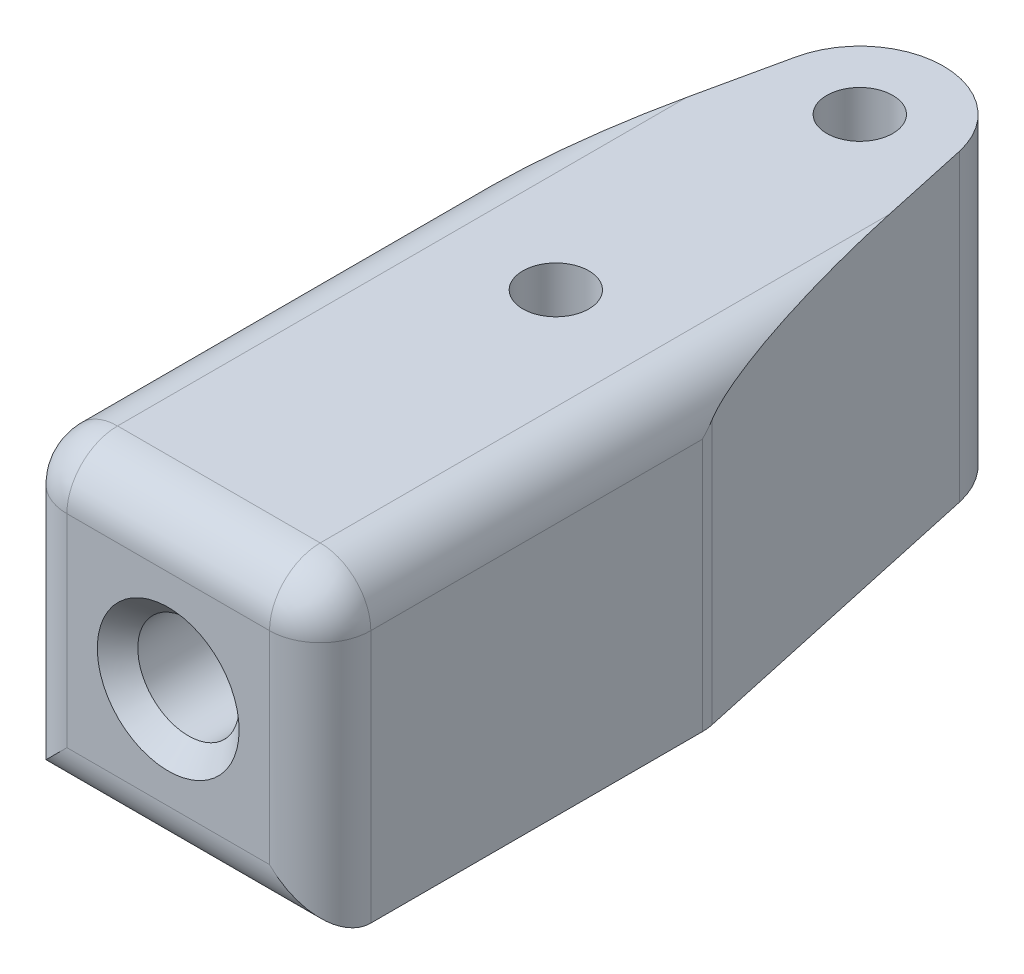
ISO-10303-21;
HEADER;
FILE_DESCRIPTION(('STEP AP214'),'2;1');
FILE_NAME('part.step','',(''),(''),'','','');
FILE_SCHEMA(('AUTOMOTIVE_DESIGN { 1 0 10303 214 1 1 1 1 }'));
ENDSEC;
DATA;
#1=APPLICATION_CONTEXT('core data for automotive mechanical design processes');
#2=APPLICATION_PROTOCOL_DEFINITION('international standard','automotive_design',2000,#1);
#3=PRODUCT_CONTEXT('',#1,'mechanical');
#4=PRODUCT('Part','Part','',(#3));
#5=PRODUCT_RELATED_PRODUCT_CATEGORY('part','',(#4));
#6=PRODUCT_DEFINITION_FORMATION('','',#4);
#7=PRODUCT_DEFINITION_CONTEXT('part definition',#1,'design');
#8=PRODUCT_DEFINITION('design','',#6,#7);
#9=PRODUCT_DEFINITION_SHAPE('','',#8);
#10=(LENGTH_UNIT() NAMED_UNIT(*) SI_UNIT(.MILLI.,.METRE.));
#11=(NAMED_UNIT(*) PLANE_ANGLE_UNIT() SI_UNIT($,.RADIAN.));
#12=(NAMED_UNIT(*) SI_UNIT($,.STERADIAN.) SOLID_ANGLE_UNIT());
#13=UNCERTAINTY_MEASURE_WITH_UNIT(LENGTH_MEASURE(1.E-05),#10,'distance_accuracy_value','');
#14=(GEOMETRIC_REPRESENTATION_CONTEXT(3) GLOBAL_UNCERTAINTY_ASSIGNED_CONTEXT((#13)) GLOBAL_UNIT_ASSIGNED_CONTEXT((#10,
#11,#12)) REPRESENTATION_CONTEXT('',''));
#15=CARTESIAN_POINT('',(0.,0.,0.));
#16=DIRECTION('',(0.,0.,1.));
#17=DIRECTION('',(1.,0.,0.));
#18=AXIS2_PLACEMENT_3D('',#15,#16,#17);
#19=CARTESIAN_POINT('',(9.09215471737954,19.05,-1.98380852863201));
#20=DIRECTION('',(-0.977014291455933,0.,0.213173812394633));
#21=DIRECTION('',(0.213173812394633,0.,0.977014291455933));
#22=AXIS2_PLACEMENT_3D('',#19,#20,#21);
#23=PLANE('',#22);
#24=CARTESIAN_POINT('',(6.34999999999999,15.875,-14.5516015336352));
#25=DIRECTION('',(-0.977014291455933,0.,0.213173812394633));
#26=DIRECTION('',(0.213173812394633,0.,0.977014291455933));
#27=AXIS2_PLACEMENT_3D('',#24,#25,#26);
#28=ELLIPSE('',#27,14.8939495162866,3.175);
#29=CARTESIAN_POINT('',(6.34999999999999,19.05,-14.5516015336352));
#30=VERTEX_POINT('',#29);
#31=CARTESIAN_POINT('',(9.45202037537258,16.551826854353,-0.334478871701571));
#32=VERTEX_POINT('',#31);
#33=EDGE_CURVE('E44',#30,#32,#28,.F.);
#34=ORIENTED_EDGE('',*,*,#33,.T.);
#35=DIRECTION('',(0.,-1.,0.));
#36=VECTOR('',#35,1.);
#37=CARTESIAN_POINT('',(9.45202037537258,19.05,-0.334478871701571));
#38=LINE('',#37,#36);
#39=CARTESIAN_POINT('',(9.45202037537258,0.,-0.334478871701571));
#40=VERTEX_POINT('',#39);
#41=EDGE_CURVE('E11',#32,#40,#38,.T.);
#42=ORIENTED_EDGE('',*,*,#41,.T.);
#43=DIRECTION('',(-0.213173812394633,0.,-0.977014291455933));
#44=VECTOR('',#43,1.);
#45=CARTESIAN_POINT('',(9.09215471737954,0.,-1.98380852863201));
#46=LINE('',#45,#44);
#47=CARTESIAN_POINT('',(5.12453766011551,0.,-20.1681179633911));
#48=VERTEX_POINT('',#47);
#49=EDGE_CURVE('E146',#40,#48,#46,.T.);
#50=ORIENTED_EDGE('',*,*,#49,.T.);
#51=DIRECTION('',(0.,-1.,0.));
#52=VECTOR('',#51,1.);
#53=CARTESIAN_POINT('',(5.12453766011551,19.05,-20.1681179633911));
#54=LINE('',#53,#52);
#55=CARTESIAN_POINT('',(5.12453766011551,19.05,-20.1681179633911));
#56=VERTEX_POINT('',#55);
#57=EDGE_CURVE('E140',#56,#48,#54,.T.);
#58=ORIENTED_EDGE('',*,*,#57,.F.);
#59=DIRECTION('',(-0.213173812394633,0.,-0.977014291455933));
#60=VECTOR('',#59,1.);
#61=CARTESIAN_POINT('',(9.09215471737954,19.05,-1.98380852863201));
#62=LINE('',#61,#60);
#63=EDGE_CURVE('E125',#30,#56,#62,.T.);
#64=ORIENTED_EDGE('',*,*,#63,.F.);
#65=EDGE_LOOP('',(#34,#42,#50,#58,#64));
#66=FACE_BOUND('',#65,.T.);
#67=ADVANCED_FACE('F35',(#66),#23,.F.);
#68=CARTESIAN_POINT('',(0.,19.05,-19.05));
#69=DIRECTION('',(0.,-1.,0.));
#70=DIRECTION('',(0.,0.,-1.));
#71=AXIS2_PLACEMENT_3D('',#68,#69,#70);
#72=CYLINDRICAL_SURFACE('',#71,5.2451);
#73=CARTESIAN_POINT('',(0.,0.,-19.05));
#74=DIRECTION('',(0.,1.,0.));
#75=DIRECTION('',(0.,0.,1.));
#76=AXIS2_PLACEMENT_3D('',#73,#74,#75);
#77=CIRCLE('',#76,5.2451);
#78=CARTESIAN_POINT('',(-5.12453766011551,0.,-20.1681179633911));
#79=VERTEX_POINT('',#78);
#80=EDGE_CURVE('E245',#48,#79,#77,.T.);
#81=ORIENTED_EDGE('',*,*,#80,.T.);
#82=DIRECTION('',(0.,-1.,0.));
#83=VECTOR('',#82,1.);
#84=CARTESIAN_POINT('',(-5.12453766011551,19.05,-20.1681179633911));
#85=LINE('',#84,#83);
#86=CARTESIAN_POINT('',(-5.12453766011551,19.05,-20.1681179633911));
#87=VERTEX_POINT('',#86);
#88=EDGE_CURVE('E142',#87,#79,#85,.T.);
#89=ORIENTED_EDGE('',*,*,#88,.F.);
#90=CARTESIAN_POINT('',(0.,19.05,-19.05));
#91=DIRECTION('',(0.,1.,0.));
#92=DIRECTION('',(0.,0.,1.));
#93=AXIS2_PLACEMENT_3D('',#90,#91,#92);
#94=CIRCLE('',#93,5.2451);
#95=EDGE_CURVE('E129',#56,#87,#94,.T.);
#96=ORIENTED_EDGE('',*,*,#95,.F.);
#97=ORIENTED_EDGE('',*,*,#57,.T.);
#98=EDGE_LOOP('',(#81,#89,#96,#97));
#99=FACE_BOUND('',#98,.T.);
#100=ADVANCED_FACE('F139',(#99),#72,.T.);
#101=CARTESIAN_POINT('',(-9.09215471737955,19.05,-1.98380852863202));
#102=DIRECTION('',(-0.977014291455933,0.,-0.213173812394633));
#103=DIRECTION('',(-0.213173812394633,0.,0.977014291455933));
#104=AXIS2_PLACEMENT_3D('',#101,#102,#103);
#105=PLANE('',#104);
#106=DIRECTION('',(0.213173812394633,0.,-0.977014291455933));
#107=VECTOR('',#106,1.);
#108=CARTESIAN_POINT('',(-9.09215471737955,0.,-1.98380852863202));
#109=LINE('',#108,#107);
#110=CARTESIAN_POINT('',(-9.45202037537259,0.,-0.334478871701568));
#111=VERTEX_POINT('',#110);
#112=EDGE_CURVE('E247',#111,#79,#109,.T.);
#113=ORIENTED_EDGE('',*,*,#112,.F.);
#114=DIRECTION('',(0.,-1.,0.));
#115=VECTOR('',#114,1.);
#116=CARTESIAN_POINT('',(-9.45202037537259,19.05,-0.334478871701569));
#117=LINE('',#116,#115);
#118=CARTESIAN_POINT('',(-9.45202037537259,16.551826854353,-0.334478871701569));
#119=VERTEX_POINT('',#118);
#120=EDGE_CURVE('E58',#111,#119,#117,.F.);
#121=ORIENTED_EDGE('',*,*,#120,.T.);
#122=CARTESIAN_POINT('',(-6.35000000000001,15.875,-14.5516015336351));
#123=DIRECTION('',(-0.977014291455933,0.,-0.213173812394633));
#124=DIRECTION('',(0.213173812394633,0.,-0.977014291455933));
#125=AXIS2_PLACEMENT_3D('',#122,#123,#124);
#126=ELLIPSE('',#125,14.8939495162865,3.175);
#127=CARTESIAN_POINT('',(-6.35,19.05,-14.5516015336351));
#128=VERTEX_POINT('',#127);
#129=EDGE_CURVE('E191',#119,#128,#126,.T.);
#130=ORIENTED_EDGE('',*,*,#129,.T.);
#131=DIRECTION('',(0.213173812394633,0.,-0.977014291455933));
#132=VECTOR('',#131,1.);
#133=CARTESIAN_POINT('',(-9.09215471737955,19.05,-1.98380852863202));
#134=LINE('',#133,#132);
#135=EDGE_CURVE('E143',#128,#87,#134,.T.);
#136=ORIENTED_EDGE('',*,*,#135,.T.);
#137=ORIENTED_EDGE('',*,*,#88,.T.);
#138=EDGE_LOOP('',(#113,#121,#130,#136,#137));
#139=FACE_BOUND('',#138,.T.);
#140=ADVANCED_FACE('F284',(#139),#105,.T.);
#141=CARTESIAN_POINT('',(-9.525,19.05,0.));
#142=DIRECTION('',(-1.,0.,0.));
#143=DIRECTION('',(0.,0.,1.));
#144=AXIS2_PLACEMENT_3D('',#141,#142,#143);
#145=PLANE('',#144);
#146=DIRECTION('',(0.,0.,-1.));
#147=VECTOR('',#146,1.);
#148=CARTESIAN_POINT('',(-9.525,0.,0.));
#149=LINE('',#148,#147);
#150=CARTESIAN_POINT('',(-9.525,0.,21.1201));
#151=VERTEX_POINT('',#150);
#152=CARTESIAN_POINT('',(-9.525,0.,0.342347982651392));
#153=VERTEX_POINT('',#152);
#154=EDGE_CURVE('E249',#151,#153,#149,.T.);
#155=ORIENTED_EDGE('',*,*,#154,.F.);
#156=DIRECTION('',(0.,-1.,0.));
#157=VECTOR('',#156,1.);
#158=CARTESIAN_POINT('',(-9.525,19.05,21.1201));
#159=LINE('',#158,#157);
#160=CARTESIAN_POINT('',(-9.525,15.875,21.1201));
#161=VERTEX_POINT('',#160);
#162=EDGE_CURVE('E189',#151,#161,#159,.F.);
#163=ORIENTED_EDGE('',*,*,#162,.T.);
#164=DIRECTION('',(0.,0.,-1.));
#165=VECTOR('',#164,1.);
#166=CARTESIAN_POINT('',(-9.525,15.875,0.));
#167=LINE('',#166,#165);
#168=CARTESIAN_POINT('',(-9.525,15.875,0.342347982651392));
#169=VERTEX_POINT('',#168);
#170=EDGE_CURVE('E185',#161,#169,#167,.T.);
#171=ORIENTED_EDGE('',*,*,#170,.T.);
#172=DIRECTION('',(0.,-1.,0.));
#173=VECTOR('',#172,1.);
#174=CARTESIAN_POINT('',(-9.525,19.05,0.342347982651392));
#175=LINE('',#174,#173);
#176=EDGE_CURVE('E187',#169,#153,#175,.T.);
#177=ORIENTED_EDGE('',*,*,#176,.T.);
#178=EDGE_LOOP('',(#155,#163,#171,#177));
#179=FACE_BOUND('',#178,.T.);
#180=ADVANCED_FACE('F280',(#179),#145,.T.);
#181=CARTESIAN_POINT('',(0.,19.05,24.2951));
#182=DIRECTION('',(0.,0.,1.));
#183=DIRECTION('',(1.,0.,0.));
#184=AXIS2_PLACEMENT_3D('',#181,#182,#183);
#185=PLANE('',#184);
#186=DIRECTION('',(-1.,0.,0.));
#187=VECTOR('',#186,1.);
#188=CARTESIAN_POINT('',(9.525,3.175,24.2951));
#189=LINE('',#188,#187);
#190=CARTESIAN_POINT('',(-6.35,3.175,24.2951));
#191=VERTEX_POINT('',#190);
#192=CARTESIAN_POINT('',(6.35,3.175,24.2951));
#193=VERTEX_POINT('',#192);
#194=EDGE_CURVE('E169',#191,#193,#189,.F.);
#195=ORIENTED_EDGE('',*,*,#194,.T.);
#196=DIRECTION('',(0.,-1.,0.));
#197=VECTOR('',#196,1.);
#198=CARTESIAN_POINT('',(6.35,19.05,24.2951));
#199=LINE('',#198,#197);
#200=CARTESIAN_POINT('',(6.35,15.875,24.2951));
#201=VERTEX_POINT('',#200);
#202=EDGE_CURVE('E172',#193,#201,#199,.F.);
#203=ORIENTED_EDGE('',*,*,#202,.T.);
#204=DIRECTION('',(-1.,0.,0.));
#205=VECTOR('',#204,1.);
#206=CARTESIAN_POINT('',(0.,15.875,24.2951));
#207=LINE('',#206,#205);
#208=CARTESIAN_POINT('',(-6.35,15.875,24.2951));
#209=VERTEX_POINT('',#208);
#210=EDGE_CURVE('E167',#201,#209,#207,.T.);
#211=ORIENTED_EDGE('',*,*,#210,.T.);
#212=DIRECTION('',(0.,-1.,0.));
#213=VECTOR('',#212,1.);
#214=CARTESIAN_POINT('',(-6.35,19.05,24.2951));
#215=LINE('',#214,#213);
#216=EDGE_CURVE('E165',#209,#191,#215,.T.);
#217=ORIENTED_EDGE('',*,*,#216,.T.);
#218=EDGE_LOOP('',(#195,#203,#211,#217));
#219=FACE_BOUND('',#218,.T.);
#220=CARTESIAN_POINT('',(0.,9.52499999999823,24.2951));
#221=DIRECTION('',(0.,0.,1.));
#222=DIRECTION('',(1.,0.,0.));
#223=AXIS2_PLACEMENT_3D('',#220,#221,#222);
#224=CIRCLE('',#223,4.44500000000004);
#225=CARTESIAN_POINT('',(4.44500000000004,9.52499999999823,24.2951));
#226=VERTEX_POINT('',#225);
#227=EDGE_CURVE('E151',#226,#226,#224,.F.);
#228=ORIENTED_EDGE('',*,*,#227,.T.);
#229=EDGE_LOOP('',(#228));
#230=FACE_BOUND('',#229,.T.);
#231=ADVANCED_FACE('F298',(#219,#230),#185,.T.);
#232=CARTESIAN_POINT('',(0.,19.05,-19.05));
#233=DIRECTION('',(0.,-1.,0.));
#234=DIRECTION('',(0.,0.,-1.));
#235=AXIS2_PLACEMENT_3D('',#232,#233,#234);
#236=CYLINDRICAL_SURFACE('',#235,2.0701);
#237=CARTESIAN_POINT('',(0.,19.05,-19.05));
#238=DIRECTION('',(0.,1.,0.));
#239=DIRECTION('',(0.,0.,1.));
#240=AXIS2_PLACEMENT_3D('',#237,#238,#239);
#241=CIRCLE('',#240,2.0701);
#242=CARTESIAN_POINT('',(0.,19.05,-21.1201));
#243=VERTEX_POINT('',#242);
#244=EDGE_CURVE('E134',#243,#243,#241,.T.);
#245=CARTESIAN_POINT('',(0.,0.,-19.05));
#246=DIRECTION('',(0.,1.,0.));
#247=DIRECTION('',(0.,0.,1.));
#248=AXIS2_PLACEMENT_3D('',#245,#246,#247);
#249=CIRCLE('',#248,2.0701);
#250=CARTESIAN_POINT('',(0.,0.,-21.1201));
#251=VERTEX_POINT('',#250);
#252=EDGE_CURVE('E232',#251,#251,#249,.T.);
#253=CARTESIAN_POINT('',(0.,19.05,-21.1201));
#254=CARTESIAN_POINT('',(0.,18.8515625,-21.1201));
#255=CARTESIAN_POINT('',(0.,18.653125,-21.1201));
#256=CARTESIAN_POINT('',(0.,18.25625,-21.1201));
#257=CARTESIAN_POINT('',(0.,18.0578125,-21.1201));
#258=CARTESIAN_POINT('',(0.,17.6609375,-21.1201));
#259=CARTESIAN_POINT('',(0.,17.4625,-21.1201));
#260=CARTESIAN_POINT('',(0.,17.065625,-21.1201));
#261=CARTESIAN_POINT('',(0.,16.8671875,-21.1201));
#262=CARTESIAN_POINT('',(0.,16.4703125,-21.1201));
#263=CARTESIAN_POINT('',(0.,16.271875,-21.1201));
#264=CARTESIAN_POINT('',(0.,15.875,-21.1201));
#265=CARTESIAN_POINT('',(0.,15.6765625,-21.1201));
#266=CARTESIAN_POINT('',(0.,15.2796875,-21.1201));
#267=CARTESIAN_POINT('',(0.,15.08125,-21.1201));
#268=CARTESIAN_POINT('',(0.,14.684375,-21.1201));
#269=CARTESIAN_POINT('',(0.,14.4859375,-21.1201));
#270=CARTESIAN_POINT('',(0.,14.0890625,-21.1201));
#271=CARTESIAN_POINT('',(0.,13.890625,-21.1201));
#272=CARTESIAN_POINT('',(0.,13.49375,-21.1201));
#273=CARTESIAN_POINT('',(0.,13.2953125,-21.1201));
#274=CARTESIAN_POINT('',(0.,12.8984375,-21.1201));
#275=CARTESIAN_POINT('',(0.,12.7,-21.1201));
#276=CARTESIAN_POINT('',(0.,12.303125,-21.1201));
#277=CARTESIAN_POINT('',(0.,12.1046875,-21.1201));
#278=CARTESIAN_POINT('',(0.,11.7078125,-21.1201));
#279=CARTESIAN_POINT('',(0.,11.509375,-21.1201));
#280=CARTESIAN_POINT('',(0.,11.1125,-21.1201));
#281=CARTESIAN_POINT('',(0.,10.9140625,-21.1201));
#282=CARTESIAN_POINT('',(0.,10.5171875,-21.1201));
#283=CARTESIAN_POINT('',(0.,10.31875,-21.1201));
#284=CARTESIAN_POINT('',(0.,9.921875,-21.1201));
#285=CARTESIAN_POINT('',(0.,9.7234375,-21.1201));
#286=CARTESIAN_POINT('',(0.,9.3265625,-21.1201));
#287=CARTESIAN_POINT('',(0.,9.128125,-21.1201));
#288=CARTESIAN_POINT('',(0.,8.73125,-21.1201));
#289=CARTESIAN_POINT('',(0.,8.5328125,-21.1201));
#290=CARTESIAN_POINT('',(0.,8.1359375,-21.1201));
#291=CARTESIAN_POINT('',(0.,7.9375,-21.1201));
#292=CARTESIAN_POINT('',(0.,7.540625,-21.1201));
#293=CARTESIAN_POINT('',(0.,7.3421875,-21.1201));
#294=CARTESIAN_POINT('',(0.,6.9453125,-21.1201));
#295=CARTESIAN_POINT('',(0.,6.746875,-21.1201));
#296=CARTESIAN_POINT('',(0.,6.35,-21.1201));
#297=CARTESIAN_POINT('',(0.,6.1515625,-21.1201));
#298=CARTESIAN_POINT('',(0.,5.7546875,-21.1201));
#299=CARTESIAN_POINT('',(0.,5.55625,-21.1201));
#300=CARTESIAN_POINT('',(0.,5.159375,-21.1201));
#301=CARTESIAN_POINT('',(0.,4.9609375,-21.1201));
#302=CARTESIAN_POINT('',(0.,4.5640625,-21.1201));
#303=CARTESIAN_POINT('',(0.,4.365625,-21.1201));
#304=CARTESIAN_POINT('',(0.,3.96875,-21.1201));
#305=CARTESIAN_POINT('',(0.,3.7703125,-21.1201));
#306=CARTESIAN_POINT('',(0.,3.3734375,-21.1201));
#307=CARTESIAN_POINT('',(0.,3.175,-21.1201));
#308=CARTESIAN_POINT('',(0.,2.778125,-21.1201));
#309=CARTESIAN_POINT('',(0.,2.5796875,-21.1201));
#310=CARTESIAN_POINT('',(0.,2.1828125,-21.1201));
#311=CARTESIAN_POINT('',(0.,1.984375,-21.1201));
#312=CARTESIAN_POINT('',(0.,1.5875,-21.1201));
#313=CARTESIAN_POINT('',(0.,1.3890625,-21.1201));
#314=CARTESIAN_POINT('',(0.,0.992187500000001,-21.1201));
#315=CARTESIAN_POINT('',(0.,0.793750000000001,-21.1201));
#316=CARTESIAN_POINT('',(0.,0.396875,-21.1201));
#317=CARTESIAN_POINT('',(0.,0.1984375,-21.1201));
#318=CARTESIAN_POINT('',(0.,0.,-21.1201));
#319=B_SPLINE_CURVE_WITH_KNOTS('',3,(#253,#254,#255,#256,#257,#258,#259,#260,#261,#262,#263,
#264,#265,#266,#267,#268,#269,#270,#271,#272,#273,#274,#275,#276,#277,#278,#279,#280,#281,#282,
#283,#284,#285,#286,#287,#288,#289,#290,#291,#292,#293,#294,#295,#296,#297,#298,#299,#300,#301,
#302,#303,#304,#305,#306,#307,#308,#309,#310,#311,#312,#313,#314,#315,#316,#317,#318),
.UNSPECIFIED.,.F.,.F.,(4,2,2,2,2,2,2,2,2,2,2,2,2,2,2,2,2,2,2,2,2,2,2,2,2,2,2,2,2,2,2,2,4),(0.,
0.5953125,1.190625,1.7859375,2.38125,2.9765625,3.571875,4.1671875,4.7625,5.3578125,5.953125,
6.5484375,7.14375,7.7390625,8.334375,8.9296875,9.525,10.1203125,10.715625,11.3109375,11.90625,
12.5015625,13.096875,13.6921875,14.2875,14.8828125,15.478125,16.0734375,16.66875,17.2640625,
17.859375,18.4546875,19.05),.UNSPECIFIED.);
#320=EDGE_CURVE('BSEAM318',#243,#251,#319,.T.);
#321=ORIENTED_EDGE('',*,*,#244,.T.);
#322=ORIENTED_EDGE('',*,*,#252,.F.);
#323=ORIENTED_EDGE('',*,*,#320,.T.);
#324=ORIENTED_EDGE('',*,*,#320,.F.);
#325=EDGE_LOOP('',(#321,#323,#322,#324));
#326=FACE_BOUND('',#325,.T.);
#327=ADVANCED_FACE('F318',(#326),#236,.F.);
#328=CARTESIAN_POINT('',(0.,19.05,0.));
#329=DIRECTION('',(0.,-1.,0.));
#330=DIRECTION('',(0.,0.,-1.));
#331=AXIS2_PLACEMENT_3D('',#328,#329,#330);
#332=CYLINDRICAL_SURFACE('',#331,2.0701);
#333=CARTESIAN_POINT('',(0.,19.05,0.));
#334=DIRECTION('',(0.,1.,0.));
#335=DIRECTION('',(0.,0.,1.));
#336=AXIS2_PLACEMENT_3D('',#333,#334,#335);
#337=CIRCLE('',#336,2.0701);
#338=CARTESIAN_POINT('',(0.,19.05,-2.07010000000002));
#339=VERTEX_POINT('',#338);
#340=EDGE_CURVE('E235',#339,#339,#337,.T.);
#341=CARTESIAN_POINT('',(0.,0.,0.));
#342=DIRECTION('',(0.,1.,0.));
#343=DIRECTION('',(0.,0.,1.));
#344=AXIS2_PLACEMENT_3D('',#341,#342,#343);
#345=CIRCLE('',#344,2.0701);
#346=CARTESIAN_POINT('',(0.,0.,-2.07010000000002));
#347=VERTEX_POINT('',#346);
#348=EDGE_CURVE('E227',#347,#347,#345,.T.);
#349=CARTESIAN_POINT('',(0.,19.05,-2.07010000000002));
#350=CARTESIAN_POINT('',(0.,18.8515625,-2.07010000000002));
#351=CARTESIAN_POINT('',(0.,18.653125,-2.07010000000002));
#352=CARTESIAN_POINT('',(0.,18.25625,-2.07010000000002));
#353=CARTESIAN_POINT('',(0.,18.0578125,-2.07010000000002));
#354=CARTESIAN_POINT('',(0.,17.6609375,-2.07010000000002));
#355=CARTESIAN_POINT('',(0.,17.4625,-2.07010000000002));
#356=CARTESIAN_POINT('',(0.,17.065625,-2.07010000000002));
#357=CARTESIAN_POINT('',(0.,16.8671875,-2.07010000000002));
#358=CARTESIAN_POINT('',(0.,16.4703125,-2.07010000000002));
#359=CARTESIAN_POINT('',(0.,16.271875,-2.07010000000002));
#360=CARTESIAN_POINT('',(0.,15.875,-2.07010000000002));
#361=CARTESIAN_POINT('',(0.,15.6765625,-2.07010000000002));
#362=CARTESIAN_POINT('',(0.,15.2796875,-2.07010000000002));
#363=CARTESIAN_POINT('',(0.,15.08125,-2.07010000000002));
#364=CARTESIAN_POINT('',(0.,14.684375,-2.07010000000002));
#365=CARTESIAN_POINT('',(0.,14.4859375,-2.07010000000002));
#366=CARTESIAN_POINT('',(0.,14.0890625,-2.07010000000002));
#367=CARTESIAN_POINT('',(0.,13.890625,-2.07010000000002));
#368=CARTESIAN_POINT('',(0.,13.49375,-2.07010000000002));
#369=CARTESIAN_POINT('',(0.,13.2953125,-2.07010000000002));
#370=CARTESIAN_POINT('',(0.,12.8984375,-2.07010000000002));
#371=CARTESIAN_POINT('',(0.,12.7,-2.07010000000002));
#372=CARTESIAN_POINT('',(0.,12.303125,-2.07010000000002));
#373=CARTESIAN_POINT('',(0.,12.1046875,-2.07010000000002));
#374=CARTESIAN_POINT('',(0.,11.7078125,-2.07010000000002));
#375=CARTESIAN_POINT('',(0.,11.509375,-2.07010000000002));
#376=CARTESIAN_POINT('',(0.,11.1125,-2.07010000000002));
#377=CARTESIAN_POINT('',(0.,10.9140625,-2.07010000000002));
#378=CARTESIAN_POINT('',(0.,10.5171875,-2.07010000000002));
#379=CARTESIAN_POINT('',(0.,10.31875,-2.07010000000002));
#380=CARTESIAN_POINT('',(0.,9.921875,-2.07010000000002));
#381=CARTESIAN_POINT('',(0.,9.7234375,-2.07010000000002));
#382=CARTESIAN_POINT('',(0.,9.3265625,-2.07010000000002));
#383=CARTESIAN_POINT('',(0.,9.128125,-2.07010000000002));
#384=CARTESIAN_POINT('',(0.,8.73125,-2.07010000000002));
#385=CARTESIAN_POINT('',(0.,8.5328125,-2.07010000000002));
#386=CARTESIAN_POINT('',(0.,8.1359375,-2.07010000000002));
#387=CARTESIAN_POINT('',(0.,7.9375,-2.07010000000002));
#388=CARTESIAN_POINT('',(0.,7.540625,-2.07010000000002));
#389=CARTESIAN_POINT('',(0.,7.3421875,-2.07010000000002));
#390=CARTESIAN_POINT('',(0.,6.9453125,-2.07010000000002));
#391=CARTESIAN_POINT('',(0.,6.746875,-2.07010000000002));
#392=CARTESIAN_POINT('',(0.,6.35,-2.07010000000002));
#393=CARTESIAN_POINT('',(0.,6.1515625,-2.07010000000002));
#394=CARTESIAN_POINT('',(0.,5.7546875,-2.07010000000002));
#395=CARTESIAN_POINT('',(0.,5.55625,-2.07010000000002));
#396=CARTESIAN_POINT('',(0.,5.159375,-2.07010000000002));
#397=CARTESIAN_POINT('',(0.,4.9609375,-2.07010000000002));
#398=CARTESIAN_POINT('',(0.,4.5640625,-2.07010000000002));
#399=CARTESIAN_POINT('',(0.,4.365625,-2.07010000000002));
#400=CARTESIAN_POINT('',(0.,3.96875,-2.07010000000002));
#401=CARTESIAN_POINT('',(0.,3.7703125,-2.07010000000002));
#402=CARTESIAN_POINT('',(0.,3.3734375,-2.07010000000002));
#403=CARTESIAN_POINT('',(0.,3.175,-2.07010000000002));
#404=CARTESIAN_POINT('',(0.,2.778125,-2.07010000000002));
#405=CARTESIAN_POINT('',(0.,2.5796875,-2.07010000000002));
#406=CARTESIAN_POINT('',(0.,2.1828125,-2.07010000000002));
#407=CARTESIAN_POINT('',(0.,1.984375,-2.07010000000002));
#408=CARTESIAN_POINT('',(0.,1.5875,-2.07010000000002));
#409=CARTESIAN_POINT('',(0.,1.3890625,-2.07010000000002));
#410=CARTESIAN_POINT('',(0.,0.992187500000001,-2.07010000000002));
#411=CARTESIAN_POINT('',(0.,0.793750000000001,-2.07010000000002));
#412=CARTESIAN_POINT('',(0.,0.396875,-2.07010000000002));
#413=CARTESIAN_POINT('',(0.,0.1984375,-2.07010000000002));
#414=CARTESIAN_POINT('',(0.,0.,-2.07010000000002));
#415=B_SPLINE_CURVE_WITH_KNOTS('',3,(#349,#350,#351,#352,#353,#354,#355,#356,#357,#358,#359,
#360,#361,#362,#363,#364,#365,#366,#367,#368,#369,#370,#371,#372,#373,#374,#375,#376,#377,#378,
#379,#380,#381,#382,#383,#384,#385,#386,#387,#388,#389,#390,#391,#392,#393,#394,#395,#396,#397,
#398,#399,#400,#401,#402,#403,#404,#405,#406,#407,#408,#409,#410,#411,#412,#413,#414),
.UNSPECIFIED.,.F.,.F.,(4,2,2,2,2,2,2,2,2,2,2,2,2,2,2,2,2,2,2,2,2,2,2,2,2,2,2,2,2,2,2,2,4),(0.,
0.5953125,1.190625,1.7859375,2.38125,2.9765625,3.571875,4.1671875,4.7625,5.3578125,5.953125,
6.5484375,7.14375,7.7390625,8.334375,8.9296875,9.525,10.1203125,10.715625,11.3109375,11.90625,
12.5015625,13.096875,13.6921875,14.2875,14.8828125,15.478125,16.0734375,16.66875,17.2640625,
17.859375,18.4546875,19.05),.UNSPECIFIED.);
#416=EDGE_CURVE('BSEAM321',#339,#347,#415,.T.);
#417=ORIENTED_EDGE('',*,*,#340,.T.);
#418=ORIENTED_EDGE('',*,*,#348,.F.);
#419=ORIENTED_EDGE('',*,*,#416,.T.);
#420=ORIENTED_EDGE('',*,*,#416,.F.);
#421=EDGE_LOOP('',(#417,#419,#418,#420));
#422=FACE_BOUND('',#421,.T.);
#423=ADVANCED_FACE('F321',(#422),#332,.F.);
#424=CARTESIAN_POINT('',(9.52499999999999,19.05,0.));
#425=DIRECTION('',(-1.,0.,0.));
#426=DIRECTION('',(0.,0.,1.));
#427=AXIS2_PLACEMENT_3D('',#424,#425,#426);
#428=PLANE('',#427);
#429=DIRECTION('',(0.,0.,-1.));
#430=VECTOR('',#429,1.);
#431=CARTESIAN_POINT('',(9.525,15.875,24.2951));
#432=LINE('',#431,#430);
#433=CARTESIAN_POINT('',(9.52499999999999,15.875,0.342347982651388));
#434=VERTEX_POINT('',#433);
#435=CARTESIAN_POINT('',(9.525,15.875,21.1201));
#436=VERTEX_POINT('',#435);
#437=EDGE_CURVE('E179',#434,#436,#432,.F.);
#438=ORIENTED_EDGE('',*,*,#437,.T.);
#439=DIRECTION('',(0.,-1.,0.));
#440=VECTOR('',#439,1.);
#441=CARTESIAN_POINT('',(9.525,0.,21.1201));
#442=LINE('',#441,#440);
#443=CARTESIAN_POINT('',(9.525,0.,21.1201));
#444=VERTEX_POINT('',#443);
#445=EDGE_CURVE('E183',#436,#444,#442,.T.);
#446=ORIENTED_EDGE('',*,*,#445,.T.);
#447=DIRECTION('',(0.,0.,-1.));
#448=VECTOR('',#447,1.);
#449=CARTESIAN_POINT('',(9.52499999999999,0.,0.));
#450=LINE('',#449,#448);
#451=CARTESIAN_POINT('',(9.52499999999999,0.,0.342347982651388));
#452=VERTEX_POINT('',#451);
#453=EDGE_CURVE('E238',#444,#452,#450,.T.);
#454=ORIENTED_EDGE('',*,*,#453,.T.);
#455=DIRECTION('',(0.,-1.,0.));
#456=VECTOR('',#455,1.);
#457=CARTESIAN_POINT('',(9.52499999999999,19.05,0.342347982651388));
#458=LINE('',#457,#456);
#459=EDGE_CURVE('E181',#452,#434,#458,.F.);
#460=ORIENTED_EDGE('',*,*,#459,.T.);
#461=EDGE_LOOP('',(#438,#446,#454,#460));
#462=FACE_BOUND('',#461,.T.);
#463=ADVANCED_FACE('F255',(#462),#428,.F.);
#464=CARTESIAN_POINT('',(0.,19.05,0.));
#465=DIRECTION('',(0.,1.,0.));
#466=DIRECTION('',(0.,0.,1.));
#467=AXIS2_PLACEMENT_3D('',#464,#465,#466);
#468=PLANE('',#467);
#469=ORIENTED_EDGE('',*,*,#340,.F.);
#470=EDGE_LOOP('',(#469));
#471=FACE_BOUND('',#470,.T.);
#472=ORIENTED_EDGE('',*,*,#244,.F.);
#473=EDGE_LOOP('',(#472));
#474=FACE_BOUND('',#473,.T.);
#475=ORIENTED_EDGE('',*,*,#135,.F.);
#476=DIRECTION('',(0.,0.,-1.));
#477=VECTOR('',#476,1.);
#478=CARTESIAN_POINT('',(-6.35,19.05,0.));
#479=LINE('',#478,#477);
#480=CARTESIAN_POINT('',(-6.35,19.05,21.1201));
#481=VERTEX_POINT('',#480);
#482=EDGE_CURVE('E177',#128,#481,#479,.F.);
#483=ORIENTED_EDGE('',*,*,#482,.T.);
#484=DIRECTION('',(-1.,0.,0.));
#485=VECTOR('',#484,1.);
#486=CARTESIAN_POINT('',(0.,19.05,21.1201));
#487=LINE('',#486,#485);
#488=CARTESIAN_POINT('',(6.35,19.05,21.1201));
#489=VERTEX_POINT('',#488);
#490=EDGE_CURVE('E175',#481,#489,#487,.F.);
#491=ORIENTED_EDGE('',*,*,#490,.T.);
#492=DIRECTION('',(0.,0.,-1.));
#493=VECTOR('',#492,1.);
#494=CARTESIAN_POINT('',(6.34999999999999,19.05,0.));
#495=LINE('',#494,#493);
#496=EDGE_CURVE('E132',#489,#30,#495,.T.);
#497=ORIENTED_EDGE('',*,*,#496,.T.);
#498=ORIENTED_EDGE('',*,*,#63,.T.);
#499=ORIENTED_EDGE('',*,*,#95,.T.);
#500=EDGE_LOOP('',(#475,#483,#491,#497,#498,#499));
#501=FACE_BOUND('',#500,.T.);
#502=ADVANCED_FACE('F128',(#471,#474,#501),#468,.T.);
#503=CARTESIAN_POINT('',(0.,0.,0.));
#504=DIRECTION('',(0.,1.,0.));
#505=DIRECTION('',(0.,0.,1.));
#506=AXIS2_PLACEMENT_3D('',#503,#504,#505);
#507=PLANE('',#506);
#508=ORIENTED_EDGE('',*,*,#348,.T.);
#509=EDGE_LOOP('',(#508));
#510=FACE_BOUND('',#509,.T.);
#511=ORIENTED_EDGE('',*,*,#252,.T.);
#512=EDGE_LOOP('',(#511));
#513=FACE_BOUND('',#512,.T.);
#514=ORIENTED_EDGE('',*,*,#453,.F.);
#515=DIRECTION('',(-1.,0.,0.));
#516=VECTOR('',#515,1.);
#517=CARTESIAN_POINT('',(-9.525,0.,21.1201));
#518=LINE('',#517,#516);
#519=EDGE_CURVE('E162',#444,#151,#518,.T.);
#520=ORIENTED_EDGE('',*,*,#519,.T.);
#521=ORIENTED_EDGE('',*,*,#154,.T.);
#522=CARTESIAN_POINT('',(-6.35,0.,0.342347982651391));
#523=DIRECTION('',(0.,1.,0.));
#524=DIRECTION('',(0.,0.,1.));
#525=AXIS2_PLACEMENT_3D('',#522,#523,#524);
#526=CIRCLE('',#525,3.175);
#527=EDGE_CURVE('E160',#153,#111,#526,.F.);
#528=ORIENTED_EDGE('',*,*,#527,.T.);
#529=ORIENTED_EDGE('',*,*,#112,.T.);
#530=ORIENTED_EDGE('',*,*,#80,.F.);
#531=ORIENTED_EDGE('',*,*,#49,.F.);
#532=CARTESIAN_POINT('',(6.34999999999999,0.,0.342347982651388));
#533=DIRECTION('',(0.,1.,0.));
#534=DIRECTION('',(0.,0.,1.));
#535=AXIS2_PLACEMENT_3D('',#532,#533,#534);
#536=CIRCLE('',#535,3.175);
#537=EDGE_CURVE('E158',#40,#452,#536,.F.);
#538=ORIENTED_EDGE('',*,*,#537,.T.);
#539=EDGE_LOOP('',(#514,#520,#521,#528,#529,#530,#531,#538));
#540=FACE_BOUND('',#539,.T.);
#541=ADVANCED_FACE('F277',(#510,#513,#540),#507,.F.);
#542=CARTESIAN_POINT('',(0.,9.52499999999823,5.24509999999997));
#543=DIRECTION('',(0.,0.,1.));
#544=DIRECTION('',(1.,0.,0.));
#545=AXIS2_PLACEMENT_3D('',#542,#543,#544);
#546=CYLINDRICAL_SURFACE('',#545,3.175);
#547=CARTESIAN_POINT('',(0.,9.52499999999823,23.0250999999999));
#548=DIRECTION('',(0.,0.,1.));
#549=DIRECTION('',(1.,0.,0.));
#550=AXIS2_PLACEMENT_3D('',#547,#548,#549);
#551=CIRCLE('',#550,3.175);
#552=CARTESIAN_POINT('',(3.175,9.52499999999823,23.0250999999999));
#553=VERTEX_POINT('',#552);
#554=EDGE_CURVE('E148',#553,#553,#551,.T.);
#555=CARTESIAN_POINT('',(0.,9.52499999999823,5.24509999999997));
#556=DIRECTION('',(0.,0.,1.));
#557=DIRECTION('',(1.,0.,0.));
#558=AXIS2_PLACEMENT_3D('',#555,#556,#557);
#559=CIRCLE('',#558,3.175);
#560=CARTESIAN_POINT('',(3.175,9.52499999999823,5.24509999999997));
#561=VERTEX_POINT('',#560);
#562=EDGE_CURVE('E222',#561,#561,#559,.T.);
#563=CARTESIAN_POINT('',(3.175,9.52499999999823,23.0250999999999));
#564=CARTESIAN_POINT('',(3.175,9.52499999999823,22.8398916666666));
#565=CARTESIAN_POINT('',(3.175,9.52499999999823,22.6546833333333));
#566=CARTESIAN_POINT('',(3.175,9.52499999999823,22.2842666666666));
#567=CARTESIAN_POINT('',(3.175,9.52499999999823,22.0990583333333));
#568=CARTESIAN_POINT('',(3.175,9.52499999999823,21.7286416666666));
#569=CARTESIAN_POINT('',(3.175,9.52499999999823,21.5434333333333));
#570=CARTESIAN_POINT('',(3.175,9.52499999999823,21.1730166666666));
#571=CARTESIAN_POINT('',(3.175,9.52499999999823,20.9878083333333));
#572=CARTESIAN_POINT('',(3.175,9.52499999999823,20.6173916666666));
#573=CARTESIAN_POINT('',(3.175,9.52499999999823,20.4321833333333));
#574=CARTESIAN_POINT('',(3.175,9.52499999999823,20.0617666666666));
#575=CARTESIAN_POINT('',(3.175,9.52499999999823,19.8765583333333));
#576=CARTESIAN_POINT('',(3.175,9.52499999999823,19.5061416666666));
#577=CARTESIAN_POINT('',(3.175,9.52499999999823,19.3209333333333));
#578=CARTESIAN_POINT('',(3.175,9.52499999999823,18.9505166666666));
#579=CARTESIAN_POINT('',(3.175,9.52499999999823,18.7653083333333));
#580=CARTESIAN_POINT('',(3.175,9.52499999999823,18.3948916666666));
#581=CARTESIAN_POINT('',(3.175,9.52499999999823,18.2096833333333));
#582=CARTESIAN_POINT('',(3.175,9.52499999999823,17.8392666666666));
#583=CARTESIAN_POINT('',(3.175,9.52499999999823,17.6540583333333));
#584=CARTESIAN_POINT('',(3.175,9.52499999999823,17.2836416666666));
#585=CARTESIAN_POINT('',(3.175,9.52499999999823,17.0984333333333));
#586=CARTESIAN_POINT('',(3.175,9.52499999999823,16.7280166666666));
#587=CARTESIAN_POINT('',(3.175,9.52499999999823,16.5428083333333));
#588=CARTESIAN_POINT('',(3.175,9.52499999999823,16.1723916666666));
#589=CARTESIAN_POINT('',(3.175,9.52499999999823,15.9871833333333));
#590=CARTESIAN_POINT('',(3.175,9.52499999999823,15.6167666666666));
#591=CARTESIAN_POINT('',(3.175,9.52499999999823,15.4315583333333));
#592=CARTESIAN_POINT('',(3.175,9.52499999999823,15.0611416666666));
#593=CARTESIAN_POINT('',(3.175,9.52499999999823,14.8759333333333));
#594=CARTESIAN_POINT('',(3.175,9.52499999999823,14.5055166666666));
#595=CARTESIAN_POINT('',(3.175,9.52499999999823,14.3203083333333));
#596=CARTESIAN_POINT('',(3.175,9.52499999999823,13.9498916666666));
#597=CARTESIAN_POINT('',(3.175,9.52499999999823,13.7646833333333));
#598=CARTESIAN_POINT('',(3.175,9.52499999999823,13.3942666666666));
#599=CARTESIAN_POINT('',(3.175,9.52499999999823,13.2090583333333));
#600=CARTESIAN_POINT('',(3.175,9.52499999999823,12.8386416666666));
#601=CARTESIAN_POINT('',(3.175,9.52499999999823,12.6534333333333));
#602=CARTESIAN_POINT('',(3.175,9.52499999999823,12.2830166666666));
#603=CARTESIAN_POINT('',(3.175,9.52499999999823,12.0978083333333));
#604=CARTESIAN_POINT('',(3.175,9.52499999999823,11.7273916666666));
#605=CARTESIAN_POINT('',(3.175,9.52499999999823,11.5421833333333));
#606=CARTESIAN_POINT('',(3.175,9.52499999999823,11.1717666666666));
#607=CARTESIAN_POINT('',(3.175,9.52499999999823,10.9865583333333));
#608=CARTESIAN_POINT('',(3.175,9.52499999999823,10.6161416666666));
#609=CARTESIAN_POINT('',(3.175,9.52499999999823,10.4309333333333));
#610=CARTESIAN_POINT('',(3.175,9.52499999999823,10.0605166666666));
#611=CARTESIAN_POINT('',(3.175,9.52499999999823,9.87530833333329));
#612=CARTESIAN_POINT('',(3.175,9.52499999999823,9.50489166666663));
#613=CARTESIAN_POINT('',(3.175,9.52499999999823,9.31968333333329));
#614=CARTESIAN_POINT('',(3.175,9.52499999999823,8.94926666666663));
#615=CARTESIAN_POINT('',(3.175,9.52499999999823,8.7640583333333));
#616=CARTESIAN_POINT('',(3.175,9.52499999999823,8.39364166666663));
#617=CARTESIAN_POINT('',(3.175,9.52499999999823,8.2084333333333));
#618=CARTESIAN_POINT('',(3.175,9.52499999999823,7.83801666666663));
#619=CARTESIAN_POINT('',(3.175,9.52499999999823,7.6528083333333));
#620=CARTESIAN_POINT('',(3.175,9.52499999999823,7.28239166666663));
#621=CARTESIAN_POINT('',(3.175,9.52499999999823,7.0971833333333));
#622=CARTESIAN_POINT('',(3.175,9.52499999999823,6.72676666666664));
#623=CARTESIAN_POINT('',(3.175,9.52499999999823,6.5415583333333));
#624=CARTESIAN_POINT('',(3.175,9.52499999999823,6.17114166666664));
#625=CARTESIAN_POINT('',(3.175,9.52499999999823,5.9859333333333));
#626=CARTESIAN_POINT('',(3.175,9.52499999999823,5.61551666666664));
#627=CARTESIAN_POINT('',(3.175,9.52499999999823,5.4303083333333));
#628=CARTESIAN_POINT('',(3.175,9.52499999999823,5.24509999999997));
#629=B_SPLINE_CURVE_WITH_KNOTS('',3,(#563,#564,#565,#566,#567,#568,#569,#570,#571,#572,#573,
#574,#575,#576,#577,#578,#579,#580,#581,#582,#583,#584,#585,#586,#587,#588,#589,#590,#591,#592,
#593,#594,#595,#596,#597,#598,#599,#600,#601,#602,#603,#604,#605,#606,#607,#608,#609,#610,#611,
#612,#613,#614,#615,#616,#617,#618,#619,#620,#621,#622,#623,#624,#625,#626,#627,#628),
.UNSPECIFIED.,.F.,.F.,(4,2,2,2,2,2,2,2,2,2,2,2,2,2,2,2,2,2,2,2,2,2,2,2,2,2,2,2,2,2,2,2,4),(0.,
0.555624999999997,1.11125,1.666875,2.2225,2.77812499999999,3.33374999999999,3.88937499999999,
4.44499999999999,5.00062499999999,5.55624999999998,6.11187499999999,6.66749999999999,
7.22312499999998,7.77874999999998,8.33437499999998,8.88999999999998,9.44562499999998,10.00125,
10.556875,11.1125,11.668125,12.22375,12.779375,13.335,13.890625,14.44625,15.001875,15.5575,
16.113125,16.66875,17.224375,17.78),.UNSPECIFIED.);
#630=EDGE_CURVE('BSEAM334',#553,#561,#629,.T.);
#631=ORIENTED_EDGE('',*,*,#554,.T.);
#632=ORIENTED_EDGE('',*,*,#562,.F.);
#633=ORIENTED_EDGE('',*,*,#630,.T.);
#634=ORIENTED_EDGE('',*,*,#630,.F.);
#635=EDGE_LOOP('',(#631,#633,#632,#634));
#636=FACE_BOUND('',#635,.T.);
#637=ADVANCED_FACE('F334',(#636),#546,.F.);
#638=CARTESIAN_POINT('',(0.,9.52499999999823,5.24509999999997));
#639=DIRECTION('',(0.,0.,1.));
#640=DIRECTION('',(1.,0.,0.));
#641=AXIS2_PLACEMENT_3D('',#638,#639,#640);
#642=PLANE('',#641);
#643=ORIENTED_EDGE('',*,*,#562,.T.);
#644=EDGE_LOOP('',(#643));
#645=FACE_BOUND('',#644,.T.);
#646=ADVANCED_FACE('F328',(#645),#642,.T.);
#647=CARTESIAN_POINT('',(0.,9.52499999999823,23.0250999999999));
#648=DIRECTION('',(0.,0.,1.));
#649=DIRECTION('',(1.,0.,0.));
#650=AXIS2_PLACEMENT_3D('',#647,#648,#649);
#651=CONICAL_SURFACE('',#650,3.175,0.785398163397449);
#652=ORIENTED_EDGE('',*,*,#227,.F.);
#653=EDGE_LOOP('',(#652));
#654=FACE_BOUND('',#653,.T.);
#655=ORIENTED_EDGE('',*,*,#554,.F.);
#656=EDGE_LOOP('',(#655));
#657=FACE_BOUND('',#656,.T.);
#658=ADVANCED_FACE('F326',(#654,#657),#651,.F.);
#659=CARTESIAN_POINT('',(6.34999999999999,19.05,0.342347982651388));
#660=DIRECTION('',(0.,-1.,0.));
#661=DIRECTION('',(0.,0.,-1.));
#662=AXIS2_PLACEMENT_3D('',#659,#660,#661);
#663=CYLINDRICAL_SURFACE('',#662,3.175);
#664=ORIENTED_EDGE('',*,*,#537,.F.);
#665=ORIENTED_EDGE('',*,*,#41,.F.);
#666=CARTESIAN_POINT('',(6.34999999999999,15.875,0.342347982651388));
#667=DIRECTION('',(0.,0.707106781186547,0.707106781186547));
#668=DIRECTION('',(0.,-0.707106781186547,0.707106781186547));
#669=AXIS2_PLACEMENT_3D('',#666,#667,#668);
#670=ELLIPSE('',#669,4.49012806053458,3.175);
#671=EDGE_CURVE('E39',#434,#32,#670,.T.);
#672=ORIENTED_EDGE('',*,*,#671,.F.);
#673=ORIENTED_EDGE('',*,*,#459,.F.);
#674=EDGE_LOOP('',(#664,#665,#672,#673));
#675=FACE_BOUND('',#674,.T.);
#676=ADVANCED_FACE('F37',(#675),#663,.T.);
#677=CARTESIAN_POINT('',(-6.35,19.05,0.342347982651391));
#678=DIRECTION('',(0.,-1.,0.));
#679=DIRECTION('',(0.,0.,-1.));
#680=AXIS2_PLACEMENT_3D('',#677,#678,#679);
#681=CYLINDRICAL_SURFACE('',#680,3.175);
#682=ORIENTED_EDGE('',*,*,#527,.F.);
#683=ORIENTED_EDGE('',*,*,#176,.F.);
#684=CARTESIAN_POINT('',(-6.35,15.875,0.342347982651391));
#685=DIRECTION('',(0.,-0.707106781186547,-0.707106781186547));
#686=DIRECTION('',(0.,0.707106781186547,-0.707106781186547));
#687=AXIS2_PLACEMENT_3D('',#684,#685,#686);
#688=ELLIPSE('',#687,4.49012806053458,3.175);
#689=EDGE_CURVE('E216',#119,#169,#688,.F.);
#690=ORIENTED_EDGE('',*,*,#689,.F.);
#691=ORIENTED_EDGE('',*,*,#120,.F.);
#692=EDGE_LOOP('',(#682,#683,#690,#691));
#693=FACE_BOUND('',#692,.T.);
#694=ADVANCED_FACE('F283',(#693),#681,.T.);
#695=CARTESIAN_POINT('',(6.34999999999999,15.875,0.));
#696=DIRECTION('',(0.,0.,1.));
#697=DIRECTION('',(1.,0.,0.));
#698=AXIS2_PLACEMENT_3D('',#695,#696,#697);
#699=CYLINDRICAL_SURFACE('',#698,3.175);
#700=ORIENTED_EDGE('',*,*,#33,.F.);
#701=ORIENTED_EDGE('',*,*,#496,.F.);
#702=CARTESIAN_POINT('',(6.35,15.875,21.1201));
#703=DIRECTION('',(0.,0.,1.));
#704=DIRECTION('',(1.,0.,0.));
#705=AXIS2_PLACEMENT_3D('',#702,#703,#704);
#706=CIRCLE('',#705,3.175);
#707=EDGE_CURVE('E211',#436,#489,#706,.T.);
#708=ORIENTED_EDGE('',*,*,#707,.F.);
#709=ORIENTED_EDGE('',*,*,#437,.F.);
#710=ORIENTED_EDGE('',*,*,#671,.T.);
#711=EDGE_LOOP('',(#700,#701,#708,#709,#710));
#712=FACE_BOUND('',#711,.T.);
#713=ADVANCED_FACE('F262',(#712),#699,.T.);
#714=CARTESIAN_POINT('',(-6.35,15.875,0.));
#715=DIRECTION('',(0.,0.,-1.));
#716=DIRECTION('',(-1.,0.,0.));
#717=AXIS2_PLACEMENT_3D('',#714,#715,#716);
#718=CYLINDRICAL_SURFACE('',#717,3.175);
#719=ORIENTED_EDGE('',*,*,#689,.T.);
#720=ORIENTED_EDGE('',*,*,#170,.F.);
#721=CARTESIAN_POINT('',(-6.35,15.875,21.1201));
#722=DIRECTION('',(0.,0.,1.));
#723=DIRECTION('',(1.,0.,0.));
#724=AXIS2_PLACEMENT_3D('',#721,#722,#723);
#725=CIRCLE('',#724,3.175);
#726=EDGE_CURVE('E208',#481,#161,#725,.T.);
#727=ORIENTED_EDGE('',*,*,#726,.F.);
#728=ORIENTED_EDGE('',*,*,#482,.F.);
#729=ORIENTED_EDGE('',*,*,#129,.F.);
#730=EDGE_LOOP('',(#719,#720,#727,#728,#729));
#731=FACE_BOUND('',#730,.T.);
#732=ADVANCED_FACE('F288',(#731),#718,.T.);
#733=CARTESIAN_POINT('',(0.,15.875,21.1201));
#734=DIRECTION('',(-1.,0.,0.));
#735=DIRECTION('',(0.,0.,1.));
#736=AXIS2_PLACEMENT_3D('',#733,#734,#735);
#737=CYLINDRICAL_SURFACE('',#736,3.175);
#738=CARTESIAN_POINT('',(6.35,15.875,21.1201));
#739=DIRECTION('',(1.,0.,0.));
#740=DIRECTION('',(0.,0.,-1.));
#741=AXIS2_PLACEMENT_3D('',#738,#739,#740);
#742=CIRCLE('',#741,3.175);
#743=EDGE_CURVE('E214',#489,#201,#742,.T.);
#744=ORIENTED_EDGE('',*,*,#743,.F.);
#745=ORIENTED_EDGE('',*,*,#490,.F.);
#746=CARTESIAN_POINT('',(-6.35,15.875,21.1201));
#747=DIRECTION('',(-1.,0.,0.));
#748=DIRECTION('',(0.,0.,1.));
#749=AXIS2_PLACEMENT_3D('',#746,#747,#748);
#750=CIRCLE('',#749,3.175);
#751=EDGE_CURVE('E205',#209,#481,#750,.T.);
#752=ORIENTED_EDGE('',*,*,#751,.F.);
#753=ORIENTED_EDGE('',*,*,#210,.F.);
#754=EDGE_LOOP('',(#744,#745,#752,#753));
#755=FACE_BOUND('',#754,.T.);
#756=ADVANCED_FACE('F296',(#755),#737,.T.);
#757=CARTESIAN_POINT('',(6.35,15.875,21.1201));
#758=DIRECTION('',(0.,0.,1.));
#759=DIRECTION('',(1.,0.,0.));
#760=AXIS2_PLACEMENT_3D('',#757,#758,#759);
#761=SPHERICAL_SURFACE('',#760,3.175);
#762=ORIENTED_EDGE('',*,*,#707,.T.);
#763=ORIENTED_EDGE('',*,*,#743,.T.);
#764=CARTESIAN_POINT('',(6.35,15.875,21.1201));
#765=DIRECTION('',(0.,1.,0.));
#766=DIRECTION('',(0.,0.,1.));
#767=AXIS2_PLACEMENT_3D('',#764,#765,#766);
#768=CIRCLE('',#767,3.175);
#769=EDGE_CURVE('E202',#436,#201,#768,.F.);
#770=ORIENTED_EDGE('',*,*,#769,.F.);
#771=EDGE_LOOP('',(#762,#763,#770));
#772=FACE_BOUND('',#771,.T.);
#773=ADVANCED_FACE('F266',(#772),#761,.T.);
#774=CARTESIAN_POINT('',(-6.35,15.875,21.1201));
#775=DIRECTION('',(0.,0.,1.));
#776=DIRECTION('',(1.,0.,0.));
#777=AXIS2_PLACEMENT_3D('',#774,#775,#776);
#778=SPHERICAL_SURFACE('',#777,3.175);
#779=ORIENTED_EDGE('',*,*,#751,.T.);
#780=ORIENTED_EDGE('',*,*,#726,.T.);
#781=CARTESIAN_POINT('',(-6.35,15.875,21.1201));
#782=DIRECTION('',(0.,1.,0.));
#783=DIRECTION('',(0.,0.,1.));
#784=AXIS2_PLACEMENT_3D('',#781,#782,#783);
#785=CIRCLE('',#784,3.175);
#786=EDGE_CURVE('E199',#209,#161,#785,.F.);
#787=ORIENTED_EDGE('',*,*,#786,.F.);
#788=EDGE_LOOP('',(#779,#780,#787));
#789=FACE_BOUND('',#788,.T.);
#790=ADVANCED_FACE('F292',(#789),#778,.T.);
#791=CARTESIAN_POINT('',(6.35,19.05,21.1201));
#792=DIRECTION('',(0.,1.,0.));
#793=DIRECTION('',(0.,0.,1.));
#794=AXIS2_PLACEMENT_3D('',#791,#792,#793);
#795=CYLINDRICAL_SURFACE('',#794,3.175);
#796=ORIENTED_EDGE('',*,*,#769,.T.);
#797=ORIENTED_EDGE('',*,*,#202,.F.);
#798=CARTESIAN_POINT('',(6.35,3.175,21.1201));
#799=DIRECTION('',(0.707106781186547,0.707106781186547,0.));
#800=DIRECTION('',(-0.707106781186547,0.707106781186547,0.));
#801=AXIS2_PLACEMENT_3D('',#798,#799,#800);
#802=ELLIPSE('',#801,4.49012806053458,3.175);
#803=EDGE_CURVE('E197',#444,#193,#802,.F.);
#804=ORIENTED_EDGE('',*,*,#803,.F.);
#805=ORIENTED_EDGE('',*,*,#445,.F.);
#806=EDGE_LOOP('',(#796,#797,#804,#805));
#807=FACE_BOUND('',#806,.T.);
#808=ADVANCED_FACE('F269',(#807),#795,.T.);
#809=CARTESIAN_POINT('',(-6.35,19.05,21.1201));
#810=DIRECTION('',(0.,-1.,0.));
#811=DIRECTION('',(0.,0.,-1.));
#812=AXIS2_PLACEMENT_3D('',#809,#810,#811);
#813=CYLINDRICAL_SURFACE('',#812,3.175);
#814=ORIENTED_EDGE('',*,*,#786,.T.);
#815=ORIENTED_EDGE('',*,*,#162,.F.);
#816=CARTESIAN_POINT('',(-6.35,3.175,21.1201));
#817=DIRECTION('',(0.707106781186547,-0.707106781186547,0.));
#818=DIRECTION('',(-0.707106781186547,-0.707106781186547,0.));
#819=AXIS2_PLACEMENT_3D('',#816,#817,#818);
#820=ELLIPSE('',#819,4.49012806053458,3.175);
#821=EDGE_CURVE('E195',#191,#151,#820,.T.);
#822=ORIENTED_EDGE('',*,*,#821,.F.);
#823=ORIENTED_EDGE('',*,*,#216,.F.);
#824=EDGE_LOOP('',(#814,#815,#822,#823));
#825=FACE_BOUND('',#824,.T.);
#826=ADVANCED_FACE('F301',(#825),#813,.T.);
#827=CARTESIAN_POINT('',(0.,3.175,21.1201));
#828=DIRECTION('',(1.,0.,0.));
#829=DIRECTION('',(0.,0.,-1.));
#830=AXIS2_PLACEMENT_3D('',#827,#828,#829);
#831=CYLINDRICAL_SURFACE('',#830,3.175);
#832=ORIENTED_EDGE('',*,*,#803,.T.);
#833=ORIENTED_EDGE('',*,*,#194,.F.);
#834=ORIENTED_EDGE('',*,*,#821,.T.);
#835=ORIENTED_EDGE('',*,*,#519,.F.);
#836=EDGE_LOOP('',(#832,#833,#834,#835));
#837=FACE_BOUND('',#836,.T.);
#838=ADVANCED_FACE('F273',(#837),#831,.T.);
#839=CLOSED_SHELL('',(#67,#100,#140,#180,#231,#327,#423,#463,#502,#541,#637,#646,#658,#676,#694,
#713,#732,#756,#773,#790,#808,#826,#838));
#840=MANIFOLD_SOLID_BREP('B2',#839);
#841=ADVANCED_BREP_SHAPE_REPRESENTATION('',(#18,#840),#14);
#842=SHAPE_DEFINITION_REPRESENTATION(#9,#841);
ENDSEC;
END-ISO-10303-21;
